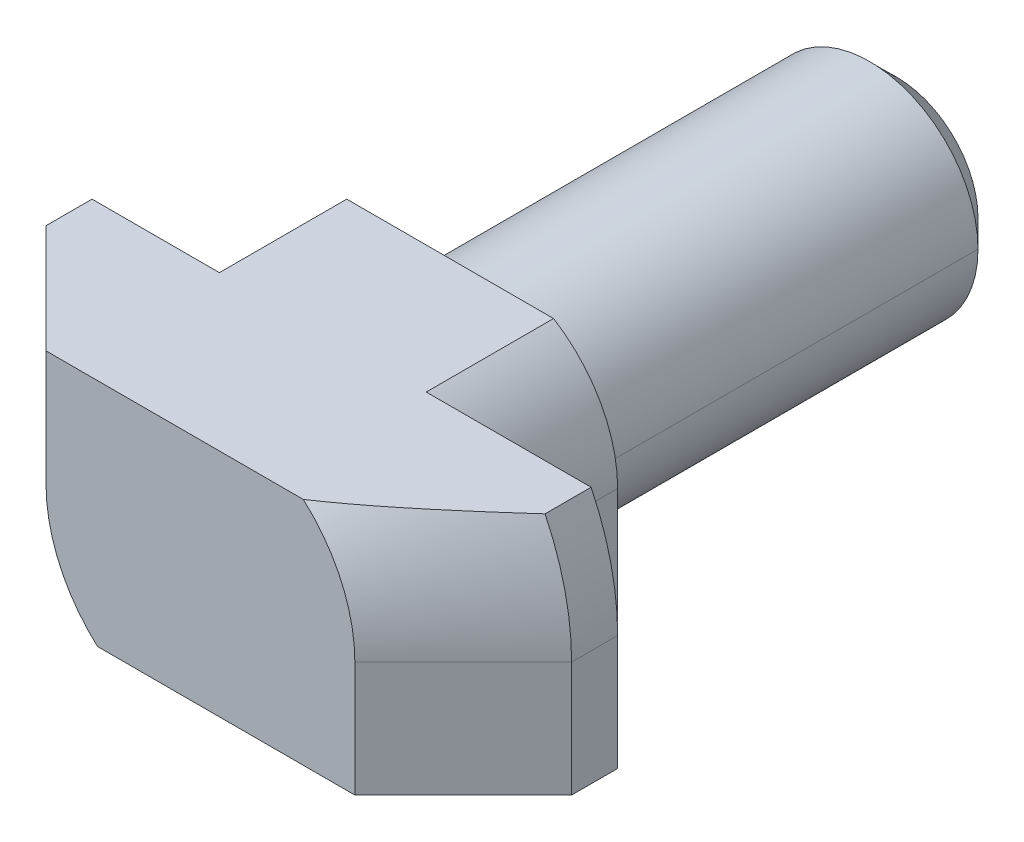
ISO-10303-21;
HEADER;
FILE_DESCRIPTION(('STEP AP214'),'2;1');
FILE_NAME('part.step','',(''),(''),'','','');
FILE_SCHEMA(('AUTOMOTIVE_DESIGN { 1 0 10303 214 1 1 1 1 }'));
ENDSEC;
DATA;
#1=APPLICATION_CONTEXT('core data for automotive mechanical design processes');
#2=APPLICATION_PROTOCOL_DEFINITION('international standard','automotive_design',2000,#1);
#3=PRODUCT_CONTEXT('',#1,'mechanical');
#4=PRODUCT('Part','Part','',(#3));
#5=PRODUCT_RELATED_PRODUCT_CATEGORY('part','',(#4));
#6=PRODUCT_DEFINITION_FORMATION('','',#4);
#7=PRODUCT_DEFINITION_CONTEXT('part definition',#1,'design');
#8=PRODUCT_DEFINITION('design','',#6,#7);
#9=PRODUCT_DEFINITION_SHAPE('','',#8);
#10=(LENGTH_UNIT() NAMED_UNIT(*) SI_UNIT(.MILLI.,.METRE.));
#11=(NAMED_UNIT(*) PLANE_ANGLE_UNIT() SI_UNIT($,.RADIAN.));
#12=(NAMED_UNIT(*) SI_UNIT($,.STERADIAN.) SOLID_ANGLE_UNIT());
#13=UNCERTAINTY_MEASURE_WITH_UNIT(LENGTH_MEASURE(1.E-05),#10,'distance_accuracy_value','');
#14=(GEOMETRIC_REPRESENTATION_CONTEXT(3) GLOBAL_UNCERTAINTY_ASSIGNED_CONTEXT((#13)) GLOBAL_UNIT_ASSIGNED_CONTEXT((#10,
#11,#12)) REPRESENTATION_CONTEXT('',''));
#15=CARTESIAN_POINT('',(0.,0.,0.));
#16=DIRECTION('',(0.,0.,1.));
#17=DIRECTION('',(1.,0.,0.));
#18=AXIS2_PLACEMENT_3D('',#15,#16,#17);
#19=CARTESIAN_POINT('',(0.,0.,-18.9151437920093));
#20=DIRECTION('',(0.,0.,1.));
#21=DIRECTION('',(-1.,0.,0.));
#22=AXIS2_PLACEMENT_3D('',#19,#20,#21);
#23=CONICAL_SURFACE('',#22,4.0848562079907,0.785398163397448);
#24=DIRECTION('',(-0.707106781186548,0.,0.707106781186547));
#25=VECTOR('',#24,1.);
#26=CARTESIAN_POINT('',(-3.,0.,-20.));
#27=LINE('',#26,#25);
#28=CARTESIAN_POINT('',(-3.,0.,-20.));
#29=VERTEX_POINT('',#28);
#30=CARTESIAN_POINT('',(-4.,0.,-19.));
#31=VERTEX_POINT('',#30);
#32=EDGE_CURVE('E19',#29,#31,#27,.T.);
#33=ORIENTED_EDGE('',*,*,#32,.T.);
#34=CARTESIAN_POINT('',(0.,0.,-19.));
#35=DIRECTION('',(0.,0.,-1.));
#36=DIRECTION('',(1.,0.,0.));
#37=AXIS2_PLACEMENT_3D('',#34,#35,#36);
#38=CIRCLE('',#37,4.);
#39=CARTESIAN_POINT('',(4.,0.,-19.));
#40=VERTEX_POINT('',#39);
#41=EDGE_CURVE('E370',#31,#40,#38,.T.);
#42=ORIENTED_EDGE('',*,*,#41,.T.);
#43=DIRECTION('',(0.707106781186548,0.,0.707106781186547));
#44=VECTOR('',#43,1.);
#45=CARTESIAN_POINT('',(3.,0.,-20.));
#46=LINE('',#45,#44);
#47=CARTESIAN_POINT('',(3.,0.,-20.));
#48=VERTEX_POINT('',#47);
#49=EDGE_CURVE('E394',#48,#40,#46,.T.);
#50=ORIENTED_EDGE('',*,*,#49,.F.);
#51=CARTESIAN_POINT('',(0.,0.,-20.));
#52=DIRECTION('',(0.,0.,-1.));
#53=DIRECTION('',(-1.,0.,0.));
#54=AXIS2_PLACEMENT_3D('',#51,#52,#53);
#55=CIRCLE('',#54,3.);
#56=EDGE_CURVE('E11',#29,#48,#55,.T.);
#57=ORIENTED_EDGE('',*,*,#56,.F.);
#58=EDGE_LOOP('',(#33,#42,#50,#57));
#59=FACE_BOUND('',#58,.T.);
#60=ADVANCED_FACE('F16',(#59),#23,.T.);
#61=CARTESIAN_POINT('',(0.,0.,-20.));
#62=DIRECTION('',(0.,0.,1.));
#63=DIRECTION('',(1.,0.,0.));
#64=AXIS2_PLACEMENT_3D('',#61,#62,#63);
#65=PLANE('',#64);
#66=CARTESIAN_POINT('',(0.,0.,-20.));
#67=DIRECTION('',(0.,0.,-1.));
#68=DIRECTION('',(-1.,0.,0.));
#69=AXIS2_PLACEMENT_3D('',#66,#67,#68);
#70=CIRCLE('',#69,3.);
#71=EDGE_CURVE('E25',#48,#29,#70,.T.);
#72=ORIENTED_EDGE('',*,*,#71,.T.);
#73=ORIENTED_EDGE('',*,*,#56,.T.);
#74=EDGE_LOOP('',(#72,#73));
#75=FACE_BOUND('',#74,.T.);
#76=ADVANCED_FACE('F702',(#75),#65,.F.);
#77=CARTESIAN_POINT('',(0.,0.,-18.9151437920093));
#78=DIRECTION('',(0.,0.,1.));
#79=DIRECTION('',(-1.,0.,0.));
#80=AXIS2_PLACEMENT_3D('',#77,#78,#79);
#81=CONICAL_SURFACE('',#80,4.0848562079907,0.785398163397448);
#82=ORIENTED_EDGE('',*,*,#49,.T.);
#83=CARTESIAN_POINT('',(0.,0.,-19.));
#84=DIRECTION('',(0.,0.,-1.));
#85=DIRECTION('',(1.,0.,0.));
#86=AXIS2_PLACEMENT_3D('',#83,#84,#85);
#87=CIRCLE('',#86,4.);
#88=EDGE_CURVE('E391',#40,#31,#87,.T.);
#89=ORIENTED_EDGE('',*,*,#88,.T.);
#90=ORIENTED_EDGE('',*,*,#32,.F.);
#91=ORIENTED_EDGE('',*,*,#71,.F.);
#92=EDGE_LOOP('',(#82,#89,#90,#91));
#93=FACE_BOUND('',#92,.T.);
#94=ADVANCED_FACE('F404',(#93),#81,.T.);
#95=CARTESIAN_POINT('',(0.,0.,-3.5));
#96=DIRECTION('',(0.,0.,-1.));
#97=DIRECTION('',(1.,0.,0.));
#98=AXIS2_PLACEMENT_3D('',#95,#96,#97);
#99=CYLINDRICAL_SURFACE('',#98,4.);
#100=DIRECTION('',(0.,0.,-1.));
#101=VECTOR('',#100,1.);
#102=CARTESIAN_POINT('',(-4.,0.,-4.7));
#103=LINE('',#102,#101);
#104=CARTESIAN_POINT('',(-4.,0.,-4.7));
#105=VERTEX_POINT('',#104);
#106=EDGE_CURVE('E374',#105,#31,#103,.T.);
#107=ORIENTED_EDGE('',*,*,#106,.T.);
#108=ORIENTED_EDGE('',*,*,#88,.F.);
#109=DIRECTION('',(0.,0.,-1.));
#110=VECTOR('',#109,1.);
#111=CARTESIAN_POINT('',(4.,0.,-4.7));
#112=LINE('',#111,#110);
#113=CARTESIAN_POINT('',(4.,0.,-4.7));
#114=VERTEX_POINT('',#113);
#115=EDGE_CURVE('E220',#114,#40,#112,.T.);
#116=ORIENTED_EDGE('',*,*,#115,.F.);
#117=CARTESIAN_POINT('',(0.,0.,-4.7));
#118=DIRECTION('',(0.,0.,1.));
#119=DIRECTION('',(1.,0.,0.));
#120=AXIS2_PLACEMENT_3D('',#117,#118,#119);
#121=CIRCLE('',#120,4.);
#122=EDGE_CURVE('E206',#105,#114,#121,.T.);
#123=ORIENTED_EDGE('',*,*,#122,.F.);
#124=EDGE_LOOP('',(#107,#108,#116,#123));
#125=FACE_BOUND('',#124,.T.);
#126=ADVANCED_FACE('F407',(#125),#99,.T.);
#127=CARTESIAN_POINT('',(0.,0.,-3.5));
#128=DIRECTION('',(0.,0.,-1.));
#129=DIRECTION('',(1.,0.,0.));
#130=AXIS2_PLACEMENT_3D('',#127,#128,#129);
#131=CYLINDRICAL_SURFACE('',#130,4.);
#132=ORIENTED_EDGE('',*,*,#115,.T.);
#133=ORIENTED_EDGE('',*,*,#41,.F.);
#134=ORIENTED_EDGE('',*,*,#106,.F.);
#135=CARTESIAN_POINT('',(0.,0.,-4.7));
#136=DIRECTION('',(0.,0.,1.));
#137=DIRECTION('',(1.,0.,0.));
#138=AXIS2_PLACEMENT_3D('',#135,#136,#137);
#139=CIRCLE('',#138,4.);
#140=EDGE_CURVE('E195',#114,#105,#139,.T.);
#141=ORIENTED_EDGE('',*,*,#140,.F.);
#142=EDGE_LOOP('',(#132,#133,#134,#141));
#143=FACE_BOUND('',#142,.T.);
#144=ADVANCED_FACE('F410',(#143),#131,.T.);
#145=CARTESIAN_POINT('',(-5.,-4.25,-3.5));
#146=DIRECTION('',(-1.,0.,0.));
#147=DIRECTION('',(0.,0.,1.));
#148=AXIS2_PLACEMENT_3D('',#145,#146,#147);
#149=PLANE('',#148);
#150=DIRECTION('',(0.,0.,1.));
#151=VECTOR('',#150,1.);
#152=CARTESIAN_POINT('',(-5.,4.25,-1.75));
#153=LINE('',#152,#151);
#154=CARTESIAN_POINT('',(-5.,4.25,-4.7));
#155=VERTEX_POINT('',#154);
#156=CARTESIAN_POINT('',(-5.,4.25,0.));
#157=VERTEX_POINT('',#156);
#158=EDGE_CURVE('E209',#155,#157,#153,.T.);
#159=ORIENTED_EDGE('',*,*,#158,.F.);
#160=DIRECTION('',(0.,1.,0.));
#161=VECTOR('',#160,1.);
#162=CARTESIAN_POINT('',(-5.,-4.25,-4.7));
#163=LINE('',#162,#161);
#164=CARTESIAN_POINT('',(-5.,0.,-4.7));
#165=VERTEX_POINT('',#164);
#166=EDGE_CURVE('E201',#165,#155,#163,.T.);
#167=ORIENTED_EDGE('',*,*,#166,.F.);
#168=DIRECTION('',(0.,0.,-1.));
#169=VECTOR('',#168,1.);
#170=CARTESIAN_POINT('',(-5.,0.,-3.96));
#171=LINE('',#170,#169);
#172=CARTESIAN_POINT('',(-5.,0.,0.));
#173=VERTEX_POINT('',#172);
#174=EDGE_CURVE('E182',#173,#165,#171,.T.);
#175=ORIENTED_EDGE('',*,*,#174,.F.);
#176=DIRECTION('',(0.,-1.,0.));
#177=VECTOR('',#176,1.);
#178=CARTESIAN_POINT('',(-5.,-4.25,0.));
#179=LINE('',#178,#177);
#180=EDGE_CURVE('E229',#157,#173,#179,.T.);
#181=ORIENTED_EDGE('',*,*,#180,.F.);
#182=EDGE_LOOP('',(#159,#167,#175,#181));
#183=FACE_BOUND('',#182,.T.);
#184=ADVANCED_FACE('F208',(#183),#149,.T.);
#185=CARTESIAN_POINT('',(-9.7,-4.25,0.));
#186=DIRECTION('',(-1.,0.,0.));
#187=DIRECTION('',(0.,0.,1.));
#188=AXIS2_PLACEMENT_3D('',#185,#186,#187);
#189=PLANE('',#188);
#190=DIRECTION('',(0.,0.,1.));
#191=VECTOR('',#190,1.);
#192=CARTESIAN_POINT('',(-9.7,4.25,0.));
#193=LINE('',#192,#191);
#194=CARTESIAN_POINT('',(-9.7,4.25,0.));
#195=VERTEX_POINT('',#194);
#196=CARTESIAN_POINT('',(-9.7,4.25,1.7));
#197=VERTEX_POINT('',#196);
#198=EDGE_CURVE('E333',#195,#197,#193,.T.);
#199=ORIENTED_EDGE('',*,*,#198,.F.);
#200=DIRECTION('',(0.,1.,0.));
#201=VECTOR('',#200,1.);
#202=CARTESIAN_POINT('',(-9.7,-4.25,0.));
#203=LINE('',#202,#201);
#204=CARTESIAN_POINT('',(-9.7,0.,0.));
#205=VERTEX_POINT('',#204);
#206=EDGE_CURVE('E230',#205,#195,#203,.T.);
#207=ORIENTED_EDGE('',*,*,#206,.F.);
#208=DIRECTION('',(0.,0.,-1.));
#209=VECTOR('',#208,1.);
#210=CARTESIAN_POINT('',(-9.7,0.,-3.96));
#211=LINE('',#210,#209);
#212=CARTESIAN_POINT('',(-9.7,0.,1.7));
#213=VERTEX_POINT('',#212);
#214=EDGE_CURVE('E270',#213,#205,#211,.T.);
#215=ORIENTED_EDGE('',*,*,#214,.F.);
#216=DIRECTION('',(0.,-1.,0.));
#217=VECTOR('',#216,1.);
#218=CARTESIAN_POINT('',(-9.7,-4.25,1.7));
#219=LINE('',#218,#217);
#220=EDGE_CURVE('E366',#197,#213,#219,.T.);
#221=ORIENTED_EDGE('',*,*,#220,.F.);
#222=EDGE_LOOP('',(#199,#207,#215,#221));
#223=FACE_BOUND('',#222,.T.);
#224=ADVANCED_FACE('F635',(#223),#189,.T.);
#225=CARTESIAN_POINT('',(-9.7,-4.25,1.7));
#226=DIRECTION('',(-0.707106781186547,0.,0.707106781186548));
#227=DIRECTION('',(0.,1.,0.));
#228=AXIS2_PLACEMENT_3D('',#225,#226,#227);
#229=PLANE('',#228);
#230=DIRECTION('',(0.707106781186548,0.,0.707106781186547));
#231=VECTOR('',#230,1.);
#232=CARTESIAN_POINT('',(-7.7,4.25,3.7));
#233=LINE('',#232,#231);
#234=CARTESIAN_POINT('',(-5.7,4.25,5.7));
#235=VERTEX_POINT('',#234);
#236=EDGE_CURVE('E337',#197,#235,#233,.T.);
#237=ORIENTED_EDGE('',*,*,#236,.F.);
#238=ORIENTED_EDGE('',*,*,#220,.T.);
#239=DIRECTION('',(-0.707106781186548,0.,-0.707106781186547));
#240=VECTOR('',#239,1.);
#241=CARTESIAN_POINT('',(-9.78485620799071,0.,1.61514379200929));
#242=LINE('',#241,#240);
#243=CARTESIAN_POINT('',(-5.7,0.,5.7));
#244=VERTEX_POINT('',#243);
#245=EDGE_CURVE('E286',#244,#213,#242,.T.);
#246=ORIENTED_EDGE('',*,*,#245,.F.);
#247=DIRECTION('',(0.,-1.,0.));
#248=VECTOR('',#247,1.);
#249=CARTESIAN_POINT('',(-5.7,-4.25,5.7));
#250=LINE('',#249,#248);
#251=EDGE_CURVE('E302',#235,#244,#250,.T.);
#252=ORIENTED_EDGE('',*,*,#251,.F.);
#253=EDGE_LOOP('',(#237,#238,#246,#252));
#254=FACE_BOUND('',#253,.T.);
#255=ADVANCED_FACE('F629',(#254),#229,.T.);
#256=CARTESIAN_POINT('',(0.,-4.25,0.));
#257=DIRECTION('',(0.,1.,0.));
#258=DIRECTION('',(0.,0.,-1.));
#259=AXIS2_PLACEMENT_3D('',#256,#257,#258);
#260=PLANE('',#259);
#261=DIRECTION('',(1.,0.,0.));
#262=VECTOR('',#261,1.);
#263=CARTESIAN_POINT('',(-2.5,-4.25,0.));
#264=LINE('',#263,#262);
#265=CARTESIAN_POINT('',(-8.71937497760017,-4.25,0.));
#266=VERTEX_POINT('',#265);
#267=CARTESIAN_POINT('',(-2.63391343821318,-4.25,0.));
#268=VERTEX_POINT('',#267);
#269=EDGE_CURVE('E271',#266,#268,#264,.T.);
#270=ORIENTED_EDGE('',*,*,#269,.T.);
#271=DIRECTION('',(0.,0.,1.));
#272=VECTOR('',#271,1.);
#273=CARTESIAN_POINT('',(-2.63391343821318,-4.25,-3.96));
#274=LINE('',#273,#272);
#275=CARTESIAN_POINT('',(-2.63391343821318,-4.25,-4.7));
#276=VERTEX_POINT('',#275);
#277=EDGE_CURVE('E194',#276,#268,#274,.T.);
#278=ORIENTED_EDGE('',*,*,#277,.F.);
#279=DIRECTION('',(-1.,0.,0.));
#280=VECTOR('',#279,1.);
#281=CARTESIAN_POINT('',(-2.125,-4.25,-4.7));
#282=LINE('',#281,#280);
#283=CARTESIAN_POINT('',(5.,-4.25,-4.7));
#284=VERTEX_POINT('',#283);
#285=EDGE_CURVE('E204',#284,#276,#282,.T.);
#286=ORIENTED_EDGE('',*,*,#285,.F.);
#287=DIRECTION('',(0.,0.,1.));
#288=VECTOR('',#287,1.);
#289=CARTESIAN_POINT('',(5.,-4.25,0.));
#290=LINE('',#289,#288);
#291=CARTESIAN_POINT('',(5.,-4.25,0.));
#292=VERTEX_POINT('',#291);
#293=EDGE_CURVE('E291',#284,#292,#290,.T.);
#294=ORIENTED_EDGE('',*,*,#293,.T.);
#295=DIRECTION('',(1.,0.,0.));
#296=VECTOR('',#295,1.);
#297=CARTESIAN_POINT('',(4.85,-4.25,0.));
#298=LINE('',#297,#296);
#299=CARTESIAN_POINT('',(9.7,-4.25,0.));
#300=VERTEX_POINT('',#299);
#301=EDGE_CURVE('E362',#292,#300,#298,.T.);
#302=ORIENTED_EDGE('',*,*,#301,.T.);
#303=DIRECTION('',(0.,0.,1.));
#304=VECTOR('',#303,1.);
#305=CARTESIAN_POINT('',(9.7,-4.25,0.85));
#306=LINE('',#305,#304);
#307=CARTESIAN_POINT('',(9.7,-4.25,1.7));
#308=VERTEX_POINT('',#307);
#309=EDGE_CURVE('E363',#300,#308,#306,.T.);
#310=ORIENTED_EDGE('',*,*,#309,.T.);
#311=DIRECTION('',(-0.707106781186548,0.,0.707106781186547));
#312=VECTOR('',#311,1.);
#313=CARTESIAN_POINT('',(5.7,-4.25,5.7));
#314=LINE('',#313,#312);
#315=CARTESIAN_POINT('',(5.7,-4.25,5.7));
#316=VERTEX_POINT('',#315);
#317=EDGE_CURVE('E234',#308,#316,#314,.T.);
#318=ORIENTED_EDGE('',*,*,#317,.T.);
#319=DIRECTION('',(-1.,0.,0.));
#320=VECTOR('',#319,1.);
#321=CARTESIAN_POINT('',(-2.85,-4.25,5.7));
#322=LINE('',#321,#320);
#323=CARTESIAN_POINT('',(-3.79835490706173,-4.25,5.7));
#324=VERTEX_POINT('',#323);
#325=EDGE_CURVE('E308',#316,#324,#322,.T.);
#326=ORIENTED_EDGE('',*,*,#325,.T.);
#327=CARTESIAN_POINT('',(-8.71937497760017,-4.25,1.70000000000001));
#328=CARTESIAN_POINT('',(-5.61977142667658,-4.25,4.48624800437153));
#329=CARTESIAN_POINT('',(-3.79835490706173,-4.25,5.70000000000001));
#330=(BOUNDED_CURVE() B_SPLINE_CURVE(2,(#327,#328,#329),.UNSPECIFIED.,.F.,
.F.) B_SPLINE_CURVE_WITH_KNOTS((3,3),(0.0541392628478098,6.38606709110727),
.UNSPECIFIED.) CURVE() GEOMETRIC_REPRESENTATION_ITEM() RATIONAL_B_SPLINE_CURVE((1.00096654090197,
1.05701422484958,1.00222486847609)) REPRESENTATION_ITEM(''));
#331=CARTESIAN_POINT('',(-8.71937497760017,-4.25,1.7));
#332=VERTEX_POINT('',#331);
#333=EDGE_CURVE('E295',#332,#324,#330,.T.);
#334=ORIENTED_EDGE('',*,*,#333,.F.);
#335=DIRECTION('',(0.,0.,1.));
#336=VECTOR('',#335,1.);
#337=CARTESIAN_POINT('',(-8.71937497760017,-4.25,-3.96));
#338=LINE('',#337,#336);
#339=EDGE_CURVE('E278',#266,#332,#338,.T.);
#340=ORIENTED_EDGE('',*,*,#339,.F.);
#341=EDGE_LOOP('',(#270,#278,#286,#294,#302,#310,#318,#326,#334,#340));
#342=FACE_BOUND('',#341,.T.);
#343=ADVANCED_FACE('F634',(#342),#260,.F.);
#344=CARTESIAN_POINT('',(9.7,-4.25,1.7));
#345=DIRECTION('',(1.,0.,0.));
#346=DIRECTION('',(0.,1.,0.));
#347=AXIS2_PLACEMENT_3D('',#344,#345,#346);
#348=PLANE('',#347);
#349=ORIENTED_EDGE('',*,*,#309,.F.);
#350=DIRECTION('',(0.,-1.,0.));
#351=VECTOR('',#350,1.);
#352=CARTESIAN_POINT('',(9.7,-4.25,0.));
#353=LINE('',#352,#351);
#354=CARTESIAN_POINT('',(9.7,0.,0.));
#355=VERTEX_POINT('',#354);
#356=EDGE_CURVE('E290',#355,#300,#353,.T.);
#357=ORIENTED_EDGE('',*,*,#356,.F.);
#358=DIRECTION('',(0.,0.,-1.));
#359=VECTOR('',#358,1.);
#360=CARTESIAN_POINT('',(9.7,0.,-3.96));
#361=LINE('',#360,#359);
#362=CARTESIAN_POINT('',(9.7,0.,1.7));
#363=VERTEX_POINT('',#362);
#364=EDGE_CURVE('E326',#363,#355,#361,.T.);
#365=ORIENTED_EDGE('',*,*,#364,.F.);
#366=DIRECTION('',(0.,-1.,0.));
#367=VECTOR('',#366,1.);
#368=CARTESIAN_POINT('',(9.7,-4.25,1.7));
#369=LINE('',#368,#367);
#370=EDGE_CURVE('E237',#363,#308,#369,.T.);
#371=ORIENTED_EDGE('',*,*,#370,.T.);
#372=EDGE_LOOP('',(#349,#357,#365,#371));
#373=FACE_BOUND('',#372,.T.);
#374=ADVANCED_FACE('F642',(#373),#348,.T.);
#375=CARTESIAN_POINT('',(5.7,-4.25,5.7));
#376=DIRECTION('',(0.707106781186547,0.,0.707106781186548));
#377=DIRECTION('',(0.,-1.,0.));
#378=AXIS2_PLACEMENT_3D('',#375,#376,#377);
#379=PLANE('',#378);
#380=ORIENTED_EDGE('',*,*,#317,.F.);
#381=ORIENTED_EDGE('',*,*,#370,.F.);
#382=DIRECTION('',(0.707106781186548,0.,-0.707106781186547));
#383=VECTOR('',#382,1.);
#384=CARTESIAN_POINT('',(9.78485620799072,0.,1.6151437920093));
#385=LINE('',#384,#383);
#386=CARTESIAN_POINT('',(5.7,0.,5.7));
#387=VERTEX_POINT('',#386);
#388=EDGE_CURVE('E238',#387,#363,#385,.T.);
#389=ORIENTED_EDGE('',*,*,#388,.F.);
#390=DIRECTION('',(0.,-1.,0.));
#391=VECTOR('',#390,1.);
#392=CARTESIAN_POINT('',(5.7,-4.25,5.7));
#393=LINE('',#392,#391);
#394=EDGE_CURVE('E314',#387,#316,#393,.T.);
#395=ORIENTED_EDGE('',*,*,#394,.T.);
#396=EDGE_LOOP('',(#380,#381,#389,#395));
#397=FACE_BOUND('',#396,.T.);
#398=ADVANCED_FACE('F586',(#397),#379,.T.);
#399=CARTESIAN_POINT('',(0.,0.,1.6151437920093));
#400=DIRECTION('',(0.,0.,-1.));
#401=DIRECTION('',(-1.,0.,0.));
#402=AXIS2_PLACEMENT_3D('',#399,#400,#401);
#403=CONICAL_SURFACE('',#402,9.78485620799071,0.785398163397449);
#404=ORIENTED_EDGE('',*,*,#388,.T.);
#405=CARTESIAN_POINT('',(0.,0.,1.7));
#406=DIRECTION('',(0.,0.,1.));
#407=DIRECTION('',(-1.,0.,0.));
#408=AXIS2_PLACEMENT_3D('',#405,#406,#407);
#409=CIRCLE('',#408,9.7);
#410=CARTESIAN_POINT('',(8.71937497760017,4.25,1.7));
#411=VERTEX_POINT('',#410);
#412=EDGE_CURVE('E329',#363,#411,#409,.T.);
#413=ORIENTED_EDGE('',*,*,#412,.T.);
#414=CARTESIAN_POINT('',(8.71937497760017,4.25,1.70000000000002));
#415=CARTESIAN_POINT('',(5.61977142667664,4.25,4.48624800437149));
#416=CARTESIAN_POINT('',(3.79835490706177,4.25,5.7));
#417=(BOUNDED_CURVE() B_SPLINE_CURVE(2,(#414,#415,#416),.UNSPECIFIED.,.F.,
.F.) B_SPLINE_CURVE_WITH_KNOTS((3,3),(0.0541392628478243,6.38606709110725),
.UNSPECIFIED.) CURVE() GEOMETRIC_REPRESENTATION_ITEM() RATIONAL_B_SPLINE_CURVE((1.00096654090197,
1.05701422484954,1.00222486847609)) REPRESENTATION_ITEM(''));
#418=CARTESIAN_POINT('',(3.79835490706176,4.25,5.7));
#419=VERTEX_POINT('',#418);
#420=EDGE_CURVE('E249',#411,#419,#417,.T.);
#421=ORIENTED_EDGE('',*,*,#420,.T.);
#422=CARTESIAN_POINT('',(0.,0.,5.7));
#423=DIRECTION('',(0.,0.,1.));
#424=DIRECTION('',(-1.,0.,0.));
#425=AXIS2_PLACEMENT_3D('',#422,#423,#424);
#426=CIRCLE('',#425,5.7);
#427=EDGE_CURVE('E318',#387,#419,#426,.T.);
#428=ORIENTED_EDGE('',*,*,#427,.F.);
#429=EDGE_LOOP('',(#404,#413,#421,#428));
#430=FACE_BOUND('',#429,.T.);
#431=ADVANCED_FACE('F580',(#430),#403,.T.);
#432=CARTESIAN_POINT('',(0.,0.,-3.96));
#433=DIRECTION('',(0.,0.,1.));
#434=DIRECTION('',(-1.,0.,0.));
#435=AXIS2_PLACEMENT_3D('',#432,#433,#434);
#436=CYLINDRICAL_SURFACE('',#435,9.7);
#437=ORIENTED_EDGE('',*,*,#364,.T.);
#438=CARTESIAN_POINT('',(0.,0.,0.));
#439=DIRECTION('',(0.,0.,-1.));
#440=DIRECTION('',(-1.,0.,0.));
#441=AXIS2_PLACEMENT_3D('',#438,#439,#440);
#442=CIRCLE('',#441,9.7);
#443=CARTESIAN_POINT('',(8.71937497760017,4.25,0.));
#444=VERTEX_POINT('',#443);
#445=EDGE_CURVE('E330',#444,#355,#442,.T.);
#446=ORIENTED_EDGE('',*,*,#445,.F.);
#447=DIRECTION('',(0.,0.,1.));
#448=VECTOR('',#447,1.);
#449=CARTESIAN_POINT('',(8.71937497760017,4.25,-3.96));
#450=LINE('',#449,#448);
#451=EDGE_CURVE('E244',#444,#411,#450,.T.);
#452=ORIENTED_EDGE('',*,*,#451,.T.);
#453=ORIENTED_EDGE('',*,*,#412,.F.);
#454=EDGE_LOOP('',(#437,#446,#452,#453));
#455=FACE_BOUND('',#454,.T.);
#456=ADVANCED_FACE('F585',(#455),#436,.T.);
#457=CARTESIAN_POINT('',(9.7,-4.25,0.));
#458=DIRECTION('',(0.,0.,-1.));
#459=DIRECTION('',(0.,-1.,0.));
#460=AXIS2_PLACEMENT_3D('',#457,#458,#459);
#461=PLANE('',#460);
#462=ORIENTED_EDGE('',*,*,#356,.T.);
#463=ORIENTED_EDGE('',*,*,#301,.F.);
#464=DIRECTION('',(0.,1.,0.));
#465=VECTOR('',#464,1.);
#466=CARTESIAN_POINT('',(5.,-4.25,0.));
#467=LINE('',#466,#465);
#468=CARTESIAN_POINT('',(5.,0.,0.));
#469=VERTEX_POINT('',#468);
#470=EDGE_CURVE('E287',#292,#469,#467,.T.);
#471=ORIENTED_EDGE('',*,*,#470,.T.);
#472=CARTESIAN_POINT('',(0.,0.,0.));
#473=DIRECTION('',(0.,0.,1.));
#474=DIRECTION('',(-1.,0.,0.));
#475=AXIS2_PLACEMENT_3D('',#472,#473,#474);
#476=CIRCLE('',#475,5.);
#477=CARTESIAN_POINT('',(2.63391343821319,4.25,0.));
#478=VERTEX_POINT('',#477);
#479=EDGE_CURVE('E350',#469,#478,#476,.T.);
#480=ORIENTED_EDGE('',*,*,#479,.T.);
#481=DIRECTION('',(-1.,0.,0.));
#482=VECTOR('',#481,1.);
#483=CARTESIAN_POINT('',(4.85,4.25,0.));
#484=LINE('',#483,#482);
#485=EDGE_CURVE('E248',#444,#478,#484,.T.);
#486=ORIENTED_EDGE('',*,*,#485,.F.);
#487=ORIENTED_EDGE('',*,*,#445,.T.);
#488=EDGE_LOOP('',(#462,#463,#471,#480,#486,#487));
#489=FACE_BOUND('',#488,.T.);
#490=ADVANCED_FACE('F614',(#489),#461,.T.);
#491=CARTESIAN_POINT('',(5.,-4.25,0.));
#492=DIRECTION('',(1.,0.,0.));
#493=DIRECTION('',(0.,1.,0.));
#494=AXIS2_PLACEMENT_3D('',#491,#492,#493);
#495=PLANE('',#494);
#496=ORIENTED_EDGE('',*,*,#293,.F.);
#497=DIRECTION('',(0.,-1.,0.));
#498=VECTOR('',#497,1.);
#499=CARTESIAN_POINT('',(5.,-4.25,-4.7));
#500=LINE('',#499,#498);
#501=CARTESIAN_POINT('',(5.,0.,-4.7));
#502=VERTEX_POINT('',#501);
#503=EDGE_CURVE('E222',#502,#284,#500,.T.);
#504=ORIENTED_EDGE('',*,*,#503,.F.);
#505=DIRECTION('',(0.,0.,-1.));
#506=VECTOR('',#505,1.);
#507=CARTESIAN_POINT('',(5.,0.,-3.96));
#508=LINE('',#507,#506);
#509=EDGE_CURVE('E353',#469,#502,#508,.T.);
#510=ORIENTED_EDGE('',*,*,#509,.F.);
#511=ORIENTED_EDGE('',*,*,#470,.F.);
#512=EDGE_LOOP('',(#496,#504,#510,#511));
#513=FACE_BOUND('',#512,.T.);
#514=ADVANCED_FACE('F623',(#513),#495,.T.);
#515=CARTESIAN_POINT('',(0.,0.,-3.96));
#516=DIRECTION('',(0.,0.,1.));
#517=DIRECTION('',(-1.,0.,0.));
#518=AXIS2_PLACEMENT_3D('',#515,#516,#517);
#519=CYLINDRICAL_SURFACE('',#518,5.);
#520=ORIENTED_EDGE('',*,*,#479,.F.);
#521=ORIENTED_EDGE('',*,*,#509,.T.);
#522=CARTESIAN_POINT('',(0.,0.,-4.7));
#523=DIRECTION('',(0.,0.,-1.));
#524=DIRECTION('',(-1.,0.,0.));
#525=AXIS2_PLACEMENT_3D('',#522,#523,#524);
#526=CIRCLE('',#525,5.);
#527=CARTESIAN_POINT('',(2.63391343821319,4.25,-4.7));
#528=VERTEX_POINT('',#527);
#529=EDGE_CURVE('E217',#528,#502,#526,.T.);
#530=ORIENTED_EDGE('',*,*,#529,.F.);
#531=DIRECTION('',(0.,0.,1.));
#532=VECTOR('',#531,1.);
#533=CARTESIAN_POINT('',(2.63391343821319,4.25,-3.96));
#534=LINE('',#533,#532);
#535=EDGE_CURVE('E262',#528,#478,#534,.T.);
#536=ORIENTED_EDGE('',*,*,#535,.T.);
#537=EDGE_LOOP('',(#520,#521,#530,#536));
#538=FACE_BOUND('',#537,.T.);
#539=ADVANCED_FACE('F605',(#538),#519,.T.);
#540=CARTESIAN_POINT('',(0.,4.25,0.));
#541=DIRECTION('',(0.,1.,0.));
#542=DIRECTION('',(0.,0.,-1.));
#543=AXIS2_PLACEMENT_3D('',#540,#541,#542);
#544=PLANE('',#543);
#545=DIRECTION('',(1.,0.,0.));
#546=VECTOR('',#545,1.);
#547=CARTESIAN_POINT('',(-2.125,4.25,-4.7));
#548=LINE('',#547,#546);
#549=EDGE_CURVE('E212',#155,#528,#548,.T.);
#550=ORIENTED_EDGE('',*,*,#549,.F.);
#551=ORIENTED_EDGE('',*,*,#158,.T.);
#552=DIRECTION('',(1.,0.,0.));
#553=VECTOR('',#552,1.);
#554=CARTESIAN_POINT('',(-2.5,4.25,0.));
#555=LINE('',#554,#553);
#556=EDGE_CURVE('E225',#195,#157,#555,.T.);
#557=ORIENTED_EDGE('',*,*,#556,.F.);
#558=ORIENTED_EDGE('',*,*,#198,.T.);
#559=ORIENTED_EDGE('',*,*,#236,.T.);
#560=DIRECTION('',(1.,0.,0.));
#561=VECTOR('',#560,1.);
#562=CARTESIAN_POINT('',(-2.85,4.25,5.7));
#563=LINE('',#562,#561);
#564=EDGE_CURVE('E322',#235,#419,#563,.T.);
#565=ORIENTED_EDGE('',*,*,#564,.T.);
#566=ORIENTED_EDGE('',*,*,#420,.F.);
#567=ORIENTED_EDGE('',*,*,#451,.F.);
#568=ORIENTED_EDGE('',*,*,#485,.T.);
#569=ORIENTED_EDGE('',*,*,#535,.F.);
#570=EDGE_LOOP('',(#550,#551,#557,#558,#559,#565,#566,#567,#568,#569));
#571=FACE_BOUND('',#570,.T.);
#572=ADVANCED_FACE('F596',(#571),#544,.T.);
#573=CARTESIAN_POINT('',(-5.7,-4.25,5.7));
#574=DIRECTION('',(0.,0.,1.));
#575=DIRECTION('',(0.,-1.,0.));
#576=AXIS2_PLACEMENT_3D('',#573,#574,#575);
#577=PLANE('',#576);
#578=ORIENTED_EDGE('',*,*,#251,.T.);
#579=CARTESIAN_POINT('',(0.,0.,5.7));
#580=DIRECTION('',(0.,0.,1.));
#581=DIRECTION('',(-1.,0.,0.));
#582=AXIS2_PLACEMENT_3D('',#579,#580,#581);
#583=CIRCLE('',#582,5.7);
#584=EDGE_CURVE('E301',#244,#324,#583,.T.);
#585=ORIENTED_EDGE('',*,*,#584,.T.);
#586=ORIENTED_EDGE('',*,*,#325,.F.);
#587=ORIENTED_EDGE('',*,*,#394,.F.);
#588=ORIENTED_EDGE('',*,*,#427,.T.);
#589=ORIENTED_EDGE('',*,*,#564,.F.);
#590=EDGE_LOOP('',(#578,#585,#586,#587,#588,#589));
#591=FACE_BOUND('',#590,.T.);
#592=ADVANCED_FACE('F542',(#591),#577,.T.);
#593=CARTESIAN_POINT('',(0.,0.,1.6151437920093));
#594=DIRECTION('',(0.,0.,-1.));
#595=DIRECTION('',(-1.,0.,0.));
#596=AXIS2_PLACEMENT_3D('',#593,#594,#595);
#597=CONICAL_SURFACE('',#596,9.78485620799071,0.785398163397449);
#598=ORIENTED_EDGE('',*,*,#245,.T.);
#599=CARTESIAN_POINT('',(0.,0.,1.7));
#600=DIRECTION('',(0.,0.,1.));
#601=DIRECTION('',(-1.,0.,0.));
#602=AXIS2_PLACEMENT_3D('',#599,#600,#601);
#603=CIRCLE('',#602,9.7);
#604=EDGE_CURVE('E282',#213,#332,#603,.T.);
#605=ORIENTED_EDGE('',*,*,#604,.T.);
#606=ORIENTED_EDGE('',*,*,#333,.T.);
#607=ORIENTED_EDGE('',*,*,#584,.F.);
#608=EDGE_LOOP('',(#598,#605,#606,#607));
#609=FACE_BOUND('',#608,.T.);
#610=ADVANCED_FACE('F536',(#609),#597,.T.);
#611=CARTESIAN_POINT('',(0.,0.,-3.96));
#612=DIRECTION('',(0.,0.,1.));
#613=DIRECTION('',(-1.,0.,0.));
#614=AXIS2_PLACEMENT_3D('',#611,#612,#613);
#615=CYLINDRICAL_SURFACE('',#614,9.7);
#616=ORIENTED_EDGE('',*,*,#214,.T.);
#617=CARTESIAN_POINT('',(0.,0.,0.));
#618=DIRECTION('',(0.,0.,-1.));
#619=DIRECTION('',(-1.,0.,0.));
#620=AXIS2_PLACEMENT_3D('',#617,#618,#619);
#621=CIRCLE('',#620,9.7);
#622=EDGE_CURVE('E266',#266,#205,#621,.T.);
#623=ORIENTED_EDGE('',*,*,#622,.F.);
#624=ORIENTED_EDGE('',*,*,#339,.T.);
#625=ORIENTED_EDGE('',*,*,#604,.F.);
#626=EDGE_LOOP('',(#616,#623,#624,#625));
#627=FACE_BOUND('',#626,.T.);
#628=ADVANCED_FACE('F541',(#627),#615,.T.);
#629=CARTESIAN_POINT('',(-5.,-4.25,0.));
#630=DIRECTION('',(0.,0.,-1.));
#631=DIRECTION('',(0.,-1.,0.));
#632=AXIS2_PLACEMENT_3D('',#629,#630,#631);
#633=PLANE('',#632);
#634=ORIENTED_EDGE('',*,*,#206,.T.);
#635=ORIENTED_EDGE('',*,*,#556,.T.);
#636=ORIENTED_EDGE('',*,*,#180,.T.);
#637=CARTESIAN_POINT('',(0.,0.,0.));
#638=DIRECTION('',(0.,0.,1.));
#639=DIRECTION('',(-1.,0.,0.));
#640=AXIS2_PLACEMENT_3D('',#637,#638,#639);
#641=CIRCLE('',#640,5.);
#642=EDGE_CURVE('E189',#173,#268,#641,.T.);
#643=ORIENTED_EDGE('',*,*,#642,.T.);
#644=ORIENTED_EDGE('',*,*,#269,.F.);
#645=ORIENTED_EDGE('',*,*,#622,.T.);
#646=EDGE_LOOP('',(#634,#635,#636,#643,#644,#645));
#647=FACE_BOUND('',#646,.T.);
#648=ADVANCED_FACE('F552',(#647),#633,.T.);
#649=CARTESIAN_POINT('',(0.,0.,-3.96));
#650=DIRECTION('',(0.,0.,1.));
#651=DIRECTION('',(-1.,0.,0.));
#652=AXIS2_PLACEMENT_3D('',#649,#650,#651);
#653=CYLINDRICAL_SURFACE('',#652,5.);
#654=ORIENTED_EDGE('',*,*,#174,.T.);
#655=CARTESIAN_POINT('',(0.,0.,-4.7));
#656=DIRECTION('',(0.,0.,-1.));
#657=DIRECTION('',(-1.,0.,0.));
#658=AXIS2_PLACEMENT_3D('',#655,#656,#657);
#659=CIRCLE('',#658,5.);
#660=EDGE_CURVE('E186',#276,#165,#659,.T.);
#661=ORIENTED_EDGE('',*,*,#660,.F.);
#662=ORIENTED_EDGE('',*,*,#277,.T.);
#663=ORIENTED_EDGE('',*,*,#642,.F.);
#664=EDGE_LOOP('',(#654,#661,#662,#663));
#665=FACE_BOUND('',#664,.T.);
#666=ADVANCED_FACE('F184',(#665),#653,.T.);
#667=CARTESIAN_POINT('',(-4.25,-4.25,-4.7));
#668=DIRECTION('',(0.,0.,-1.));
#669=DIRECTION('',(0.,-1.,0.));
#670=AXIS2_PLACEMENT_3D('',#667,#668,#669);
#671=PLANE('',#670);
#672=ORIENTED_EDGE('',*,*,#122,.T.);
#673=ORIENTED_EDGE('',*,*,#140,.T.);
#674=EDGE_LOOP('',(#672,#673));
#675=FACE_BOUND('',#674,.T.);
#676=ORIENTED_EDGE('',*,*,#166,.T.);
#677=ORIENTED_EDGE('',*,*,#549,.T.);
#678=ORIENTED_EDGE('',*,*,#529,.T.);
#679=ORIENTED_EDGE('',*,*,#503,.T.);
#680=ORIENTED_EDGE('',*,*,#285,.T.);
#681=ORIENTED_EDGE('',*,*,#660,.T.);
#682=EDGE_LOOP('',(#676,#677,#678,#679,#680,#681));
#683=FACE_BOUND('',#682,.T.);
#684=ADVANCED_FACE('F199',(#675,#683),#671,.T.);
#685=CLOSED_SHELL('',(#60,#76,#94,#126,#144,#184,#224,#255,#343,#374,#398,#431,#456,#490,#514,
#539,#572,#592,#610,#628,#648,#666,#684));
#686=MANIFOLD_SOLID_BREP('B1',#685);
#687=ADVANCED_BREP_SHAPE_REPRESENTATION('',(#18,#686),#14);
#688=SHAPE_DEFINITION_REPRESENTATION(#9,#687);
ENDSEC;
END-ISO-10303-21;
